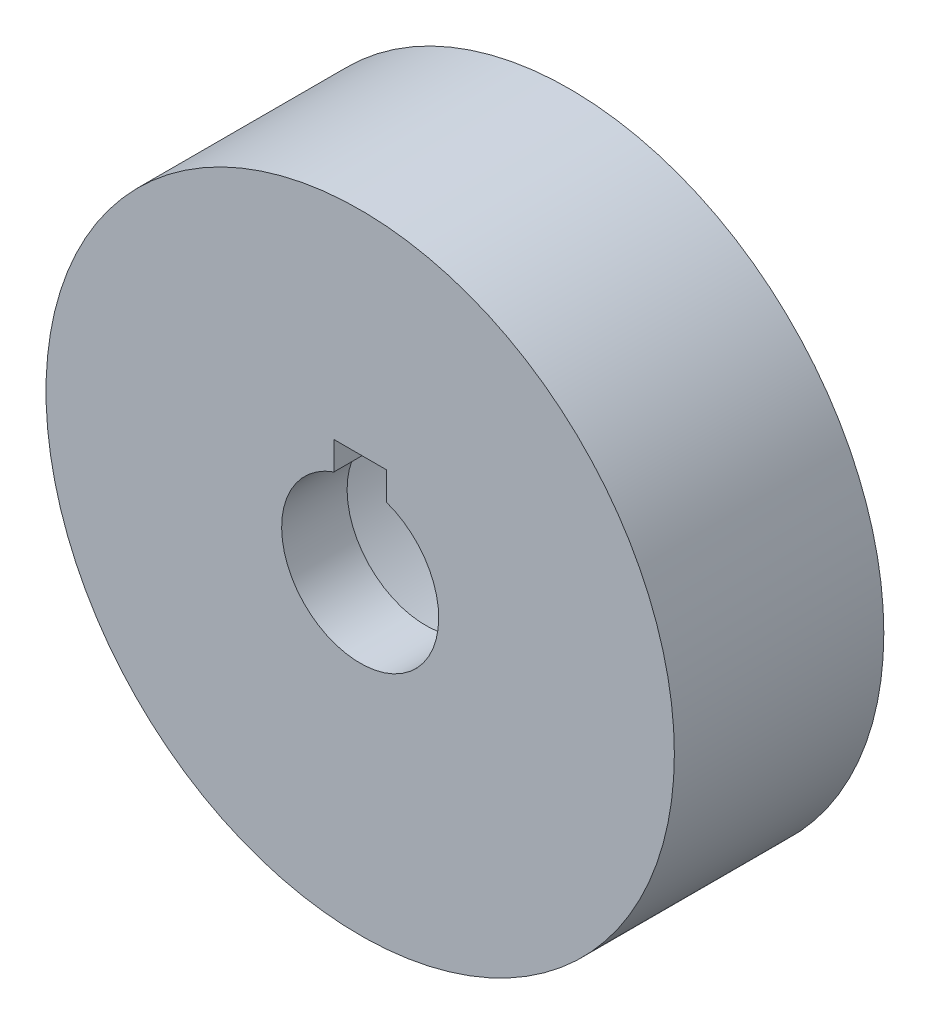
ISO-10303-21;
HEADER;
FILE_DESCRIPTION(('STEP AP214'),'2;1');
FILE_NAME('part.step','',(''),(''),'','','');
FILE_SCHEMA(('AUTOMOTIVE_DESIGN { 1 0 10303 214 1 1 1 1 }'));
ENDSEC;
DATA;
#1=APPLICATION_CONTEXT('core data for automotive mechanical design processes');
#2=APPLICATION_PROTOCOL_DEFINITION('international standard','automotive_design',2000,#1);
#3=PRODUCT_CONTEXT('',#1,'mechanical');
#4=PRODUCT('Part','Part','',(#3));
#5=PRODUCT_RELATED_PRODUCT_CATEGORY('part','',(#4));
#6=PRODUCT_DEFINITION_FORMATION('','',#4);
#7=PRODUCT_DEFINITION_CONTEXT('part definition',#1,'design');
#8=PRODUCT_DEFINITION('design','',#6,#7);
#9=PRODUCT_DEFINITION_SHAPE('','',#8);
#10=(LENGTH_UNIT() NAMED_UNIT(*) SI_UNIT(.MILLI.,.METRE.));
#11=(NAMED_UNIT(*) PLANE_ANGLE_UNIT() SI_UNIT($,.RADIAN.));
#12=(NAMED_UNIT(*) SI_UNIT($,.STERADIAN.) SOLID_ANGLE_UNIT());
#13=UNCERTAINTY_MEASURE_WITH_UNIT(LENGTH_MEASURE(1.E-05),#10,'distance_accuracy_value','');
#14=(GEOMETRIC_REPRESENTATION_CONTEXT(3) GLOBAL_UNCERTAINTY_ASSIGNED_CONTEXT((#13)) GLOBAL_UNIT_ASSIGNED_CONTEXT((#10,
#11,#12)) REPRESENTATION_CONTEXT('',''));
#15=CARTESIAN_POINT('',(0.,0.,0.));
#16=DIRECTION('',(0.,0.,1.));
#17=DIRECTION('',(1.,0.,0.));
#18=AXIS2_PLACEMENT_3D('',#15,#16,#17);
#19=CARTESIAN_POINT('',(0.,0.,0.));
#20=DIRECTION('',(0.,0.,1.));
#21=DIRECTION('',(1.,0.,0.));
#22=AXIS2_PLACEMENT_3D('',#19,#20,#21);
#23=PLANE('',#22);
#24=CARTESIAN_POINT('',(0.,0.,0.));
#25=DIRECTION('',(0.,0.,1.));
#26=DIRECTION('',(1.,0.,0.));
#27=AXIS2_PLACEMENT_3D('',#24,#25,#26);
#28=CIRCLE('',#27,6.);
#29=CARTESIAN_POINT('',(-2.,5.65685424949238,0.));
#30=VERTEX_POINT('',#29);
#31=CARTESIAN_POINT('',(2.,5.65685424949238,0.));
#32=VERTEX_POINT('',#31);
#33=EDGE_CURVE('E155',#30,#32,#28,.T.);
#34=ORIENTED_EDGE('',*,*,#33,.T.);
#35=DIRECTION('',(0.,-1.,0.));
#36=VECTOR('',#35,1.);
#37=CARTESIAN_POINT('',(2.,0.,0.));
#38=LINE('',#37,#36);
#39=CARTESIAN_POINT('',(2.,7.8,0.));
#40=VERTEX_POINT('',#39);
#41=EDGE_CURVE('E84',#40,#32,#38,.T.);
#42=ORIENTED_EDGE('',*,*,#41,.F.);
#43=DIRECTION('',(1.,0.,0.));
#44=VECTOR('',#43,1.);
#45=CARTESIAN_POINT('',(0.,7.8,0.));
#46=LINE('',#45,#44);
#47=CARTESIAN_POINT('',(-2.,7.8,0.));
#48=VERTEX_POINT('',#47);
#49=EDGE_CURVE('E179',#48,#40,#46,.T.);
#50=ORIENTED_EDGE('',*,*,#49,.F.);
#51=DIRECTION('',(0.,-1.,0.));
#52=VECTOR('',#51,1.);
#53=CARTESIAN_POINT('',(-2.,0.,0.));
#54=LINE('',#53,#52);
#55=EDGE_CURVE('E175',#48,#30,#54,.T.);
#56=ORIENTED_EDGE('',*,*,#55,.T.);
#57=EDGE_LOOP('',(#34,#42,#50,#56));
#58=FACE_BOUND('',#57,.T.);
#59=CARTESIAN_POINT('',(0.,0.,0.));
#60=DIRECTION('',(0.,0.,1.));
#61=DIRECTION('',(1.,0.,0.));
#62=AXIS2_PLACEMENT_3D('',#59,#60,#61);
#63=CIRCLE('',#62,15.5);
#64=CARTESIAN_POINT('',(15.5,0.,0.));
#65=VERTEX_POINT('',#64);
#66=EDGE_CURVE('E11',#65,#65,#63,.T.);
#67=ORIENTED_EDGE('',*,*,#66,.F.);
#68=EDGE_LOOP('',(#67));
#69=FACE_BOUND('',#68,.T.);
#70=ADVANCED_FACE('F47',(#58,#69),#23,.F.);
#71=CARTESIAN_POINT('',(0.,0.,5.));
#72=DIRECTION('',(0.,0.,-1.));
#73=DIRECTION('',(-1.,0.,0.));
#74=AXIS2_PLACEMENT_3D('',#71,#72,#73);
#75=CYLINDRICAL_SURFACE('',#74,6.);
#76=ORIENTED_EDGE('',*,*,#33,.F.);
#77=DIRECTION('',(0.,0.,-1.));
#78=VECTOR('',#77,1.);
#79=CARTESIAN_POINT('',(-2.,5.65685424949238,5.));
#80=LINE('',#79,#78);
#81=CARTESIAN_POINT('',(-2.,5.65685424949238,5.));
#82=VERTEX_POINT('',#81);
#83=EDGE_CURVE('E51',#82,#30,#80,.T.);
#84=ORIENTED_EDGE('',*,*,#83,.F.);
#85=CARTESIAN_POINT('',(0.,0.,5.));
#86=DIRECTION('',(0.,0.,1.));
#87=DIRECTION('',(1.,0.,0.));
#88=AXIS2_PLACEMENT_3D('',#85,#86,#87);
#89=CIRCLE('',#88,6.);
#90=CARTESIAN_POINT('',(2.,5.65685424949238,5.));
#91=VERTEX_POINT('',#90);
#92=EDGE_CURVE('E161',#82,#91,#89,.T.);
#93=ORIENTED_EDGE('',*,*,#92,.T.);
#94=DIRECTION('',(0.,0.,-1.));
#95=VECTOR('',#94,1.);
#96=CARTESIAN_POINT('',(2.,5.65685424949238,5.));
#97=LINE('',#96,#95);
#98=EDGE_CURVE('E91',#91,#32,#97,.T.);
#99=ORIENTED_EDGE('',*,*,#98,.T.);
#100=EDGE_LOOP('',(#76,#84,#93,#99));
#101=FACE_BOUND('',#100,.T.);
#102=ADVANCED_FACE('F198',(#101),#75,.F.);
#103=CARTESIAN_POINT('',(-2.,0.,5.));
#104=DIRECTION('',(1.,0.,0.));
#105=DIRECTION('',(0.,0.,-1.));
#106=AXIS2_PLACEMENT_3D('',#103,#104,#105);
#107=PLANE('',#106);
#108=ORIENTED_EDGE('',*,*,#55,.F.);
#109=DIRECTION('',(0.,0.,-1.));
#110=VECTOR('',#109,1.);
#111=CARTESIAN_POINT('',(-2.,7.8,5.));
#112=LINE('',#111,#110);
#113=CARTESIAN_POINT('',(-2.,7.8,5.));
#114=VERTEX_POINT('',#113);
#115=EDGE_CURVE('E189',#114,#48,#112,.T.);
#116=ORIENTED_EDGE('',*,*,#115,.F.);
#117=DIRECTION('',(0.,-1.,0.));
#118=VECTOR('',#117,1.);
#119=CARTESIAN_POINT('',(-2.,0.,5.));
#120=LINE('',#119,#118);
#121=EDGE_CURVE('E164',#114,#82,#120,.T.);
#122=ORIENTED_EDGE('',*,*,#121,.T.);
#123=ORIENTED_EDGE('',*,*,#83,.T.);
#124=EDGE_LOOP('',(#108,#116,#122,#123));
#125=FACE_BOUND('',#124,.T.);
#126=ADVANCED_FACE('F196',(#125),#107,.T.);
#127=CARTESIAN_POINT('',(0.,7.8,5.));
#128=DIRECTION('',(0.,1.,0.));
#129=DIRECTION('',(0.,0.,1.));
#130=AXIS2_PLACEMENT_3D('',#127,#128,#129);
#131=PLANE('',#130);
#132=ORIENTED_EDGE('',*,*,#49,.T.);
#133=DIRECTION('',(0.,0.,-1.));
#134=VECTOR('',#133,1.);
#135=CARTESIAN_POINT('',(2.,7.8,5.));
#136=LINE('',#135,#134);
#137=CARTESIAN_POINT('',(2.,7.8,5.));
#138=VERTEX_POINT('',#137);
#139=EDGE_CURVE('E187',#138,#40,#136,.T.);
#140=ORIENTED_EDGE('',*,*,#139,.F.);
#141=DIRECTION('',(1.,0.,0.));
#142=VECTOR('',#141,1.);
#143=CARTESIAN_POINT('',(0.,7.8,5.));
#144=LINE('',#143,#142);
#145=EDGE_CURVE('E168',#114,#138,#144,.T.);
#146=ORIENTED_EDGE('',*,*,#145,.F.);
#147=ORIENTED_EDGE('',*,*,#115,.T.);
#148=EDGE_LOOP('',(#132,#140,#146,#147));
#149=FACE_BOUND('',#148,.T.);
#150=ADVANCED_FACE('F201',(#149),#131,.F.);
#151=CARTESIAN_POINT('',(0.,0.,5.));
#152=DIRECTION('',(0.,0.,-1.));
#153=DIRECTION('',(-1.,0.,0.));
#154=AXIS2_PLACEMENT_3D('',#151,#152,#153);
#155=CYLINDRICAL_SURFACE('',#154,24.);
#156=CARTESIAN_POINT('',(0.,0.,5.));
#157=DIRECTION('',(0.,0.,1.));
#158=DIRECTION('',(1.,0.,0.));
#159=AXIS2_PLACEMENT_3D('',#156,#157,#158);
#160=CIRCLE('',#159,24.);
#161=CARTESIAN_POINT('',(24.,0.,5.));
#162=VERTEX_POINT('',#161);
#163=EDGE_CURVE('E157',#162,#162,#160,.T.);
#164=ORIENTED_EDGE('',*,*,#163,.F.);
#165=EDGE_LOOP('',(#164));
#166=FACE_BOUND('',#165,.T.);
#167=CARTESIAN_POINT('',(0.,0.,-11.));
#168=DIRECTION('',(0.,0.,1.));
#169=DIRECTION('',(1.,0.,0.));
#170=AXIS2_PLACEMENT_3D('',#167,#168,#169);
#171=CIRCLE('',#170,24.);
#172=CARTESIAN_POINT('',(24.,0.,-11.));
#173=VERTEX_POINT('',#172);
#174=EDGE_CURVE('E152',#173,#173,#171,.T.);
#175=ORIENTED_EDGE('',*,*,#174,.T.);
#176=EDGE_LOOP('',(#175));
#177=FACE_BOUND('',#176,.T.);
#178=ADVANCED_FACE('F49',(#166,#177),#155,.T.);
#179=CARTESIAN_POINT('',(2.,0.,5.));
#180=DIRECTION('',(1.,0.,0.));
#181=DIRECTION('',(0.,0.,-1.));
#182=AXIS2_PLACEMENT_3D('',#179,#180,#181);
#183=PLANE('',#182);
#184=ORIENTED_EDGE('',*,*,#41,.T.);
#185=ORIENTED_EDGE('',*,*,#98,.F.);
#186=DIRECTION('',(0.,-1.,0.));
#187=VECTOR('',#186,1.);
#188=CARTESIAN_POINT('',(2.,0.,5.));
#189=LINE('',#188,#187);
#190=EDGE_CURVE('E66',#138,#91,#189,.T.);
#191=ORIENTED_EDGE('',*,*,#190,.F.);
#192=ORIENTED_EDGE('',*,*,#139,.T.);
#193=EDGE_LOOP('',(#184,#185,#191,#192));
#194=FACE_BOUND('',#193,.T.);
#195=ADVANCED_FACE('F203',(#194),#183,.F.);
#196=CARTESIAN_POINT('',(0.,0.,5.));
#197=DIRECTION('',(0.,0.,1.));
#198=DIRECTION('',(1.,0.,0.));
#199=AXIS2_PLACEMENT_3D('',#196,#197,#198);
#200=PLANE('',#199);
#201=ORIENTED_EDGE('',*,*,#163,.T.);
#202=EDGE_LOOP('',(#201));
#203=FACE_BOUND('',#202,.T.);
#204=ORIENTED_EDGE('',*,*,#92,.F.);
#205=ORIENTED_EDGE('',*,*,#121,.F.);
#206=ORIENTED_EDGE('',*,*,#145,.T.);
#207=ORIENTED_EDGE('',*,*,#190,.T.);
#208=EDGE_LOOP('',(#204,#205,#206,#207));
#209=FACE_BOUND('',#208,.T.);
#210=ADVANCED_FACE('F204',(#203,#209),#200,.T.);
#211=CARTESIAN_POINT('',(0.,0.,-11.));
#212=DIRECTION('',(0.,0.,1.));
#213=DIRECTION('',(1.,0.,0.));
#214=AXIS2_PLACEMENT_3D('',#211,#212,#213);
#215=CYLINDRICAL_SURFACE('',#214,15.5);
#216=CARTESIAN_POINT('',(0.,0.,-11.));
#217=DIRECTION('',(0.,0.,1.));
#218=DIRECTION('',(1.,0.,0.));
#219=AXIS2_PLACEMENT_3D('',#216,#217,#218);
#220=CIRCLE('',#219,15.5);
#221=CARTESIAN_POINT('',(15.5,0.,-11.));
#222=VERTEX_POINT('',#221);
#223=EDGE_CURVE('E148',#222,#222,#220,.T.);
#224=ORIENTED_EDGE('',*,*,#223,.F.);
#225=EDGE_LOOP('',(#224));
#226=FACE_BOUND('',#225,.T.);
#227=ORIENTED_EDGE('',*,*,#66,.T.);
#228=EDGE_LOOP('',(#227));
#229=FACE_BOUND('',#228,.T.);
#230=ADVANCED_FACE('F206',(#226,#229),#215,.F.);
#231=CARTESIAN_POINT('',(0.,0.,-11.));
#232=DIRECTION('',(0.,0.,1.));
#233=DIRECTION('',(1.,0.,0.));
#234=AXIS2_PLACEMENT_3D('',#231,#232,#233);
#235=PLANE('',#234);
#236=CARTESIAN_POINT('',(0.,-19.75,-11.));
#237=DIRECTION('',(0.,0.,-1.));
#238=DIRECTION('',(-1.,0.,0.));
#239=AXIS2_PLACEMENT_3D('',#236,#237,#238);
#240=CIRCLE('',#239,2.1);
#241=CARTESIAN_POINT('',(-2.1,-19.75,-11.));
#242=VERTEX_POINT('',#241);
#243=EDGE_CURVE('E119',#242,#242,#240,.T.);
#244=ORIENTED_EDGE('',*,*,#243,.F.);
#245=EDGE_LOOP('',(#244));
#246=FACE_BOUND('',#245,.T.);
#247=CARTESIAN_POINT('',(-19.75,0.,-11.));
#248=DIRECTION('',(0.,0.,-1.));
#249=DIRECTION('',(-1.,0.,0.));
#250=AXIS2_PLACEMENT_3D('',#247,#248,#249);
#251=CIRCLE('',#250,2.1);
#252=CARTESIAN_POINT('',(-21.85,0.,-11.));
#253=VERTEX_POINT('',#252);
#254=EDGE_CURVE('E118',#253,#253,#251,.T.);
#255=ORIENTED_EDGE('',*,*,#254,.F.);
#256=EDGE_LOOP('',(#255));
#257=FACE_BOUND('',#256,.T.);
#258=CARTESIAN_POINT('',(0.,19.75,-11.));
#259=DIRECTION('',(0.,0.,-1.));
#260=DIRECTION('',(-1.,0.,0.));
#261=AXIS2_PLACEMENT_3D('',#258,#259,#260);
#262=CIRCLE('',#261,2.1);
#263=CARTESIAN_POINT('',(-2.1,19.75,-11.));
#264=VERTEX_POINT('',#263);
#265=EDGE_CURVE('E132',#264,#264,#262,.T.);
#266=ORIENTED_EDGE('',*,*,#265,.F.);
#267=EDGE_LOOP('',(#266));
#268=FACE_BOUND('',#267,.T.);
#269=CARTESIAN_POINT('',(19.75,0.,-11.));
#270=DIRECTION('',(0.,0.,-1.));
#271=DIRECTION('',(-1.,0.,0.));
#272=AXIS2_PLACEMENT_3D('',#269,#270,#271);
#273=CIRCLE('',#272,2.1);
#274=CARTESIAN_POINT('',(17.65,0.,-11.));
#275=VERTEX_POINT('',#274);
#276=EDGE_CURVE('E140',#275,#275,#273,.T.);
#277=ORIENTED_EDGE('',*,*,#276,.F.);
#278=EDGE_LOOP('',(#277));
#279=FACE_BOUND('',#278,.T.);
#280=ORIENTED_EDGE('',*,*,#223,.T.);
#281=EDGE_LOOP('',(#280));
#282=FACE_BOUND('',#281,.T.);
#283=ORIENTED_EDGE('',*,*,#174,.F.);
#284=EDGE_LOOP('',(#283));
#285=FACE_BOUND('',#284,.T.);
#286=ADVANCED_FACE('F214',(#246,#257,#268,#279,#282,#285),#235,.F.);
#287=CARTESIAN_POINT('',(19.75,0.,-0.999999999999999));
#288=DIRECTION('',(0.,0.,-1.));
#289=DIRECTION('',(-1.,0.,0.));
#290=AXIS2_PLACEMENT_3D('',#287,#288,#289);
#291=CONICAL_SURFACE('',#290,2.1,1.02974425867665);
#292=CARTESIAN_POINT('',(19.75,0.,0.261807299957877));
#293=VERTEX_POINT('',#292);
#294=VERTEX_LOOP('',#293);
#295=FACE_BOUND('',#294,.T.);
#296=CARTESIAN_POINT('',(19.75,0.,-0.999999999999999));
#297=DIRECTION('',(0.,0.,-1.));
#298=DIRECTION('',(-1.,0.,0.));
#299=AXIS2_PLACEMENT_3D('',#296,#297,#298);
#300=CIRCLE('',#299,2.1);
#301=CARTESIAN_POINT('',(17.65,0.,-0.999999999999999));
#302=VERTEX_POINT('',#301);
#303=EDGE_CURVE('E144',#302,#302,#300,.T.);
#304=ORIENTED_EDGE('',*,*,#303,.T.);
#305=EDGE_LOOP('',(#304));
#306=FACE_BOUND('',#305,.T.);
#307=ADVANCED_FACE('F280',(#295,#306),#291,.F.);
#308=CARTESIAN_POINT('',(19.75,0.,-11.));
#309=DIRECTION('',(0.,0.,-1.));
#310=DIRECTION('',(-1.,0.,0.));
#311=AXIS2_PLACEMENT_3D('',#308,#309,#310);
#312=CYLINDRICAL_SURFACE('',#311,2.1);
#313=ORIENTED_EDGE('',*,*,#303,.F.);
#314=EDGE_LOOP('',(#313));
#315=FACE_BOUND('',#314,.T.);
#316=ORIENTED_EDGE('',*,*,#276,.T.);
#317=EDGE_LOOP('',(#316));
#318=FACE_BOUND('',#317,.T.);
#319=ADVANCED_FACE('F290',(#315,#318),#312,.F.);
#320=CARTESIAN_POINT('',(0.,19.75,-0.999999999999999));
#321=DIRECTION('',(0.,0.,-1.));
#322=DIRECTION('',(-1.,0.,0.));
#323=AXIS2_PLACEMENT_3D('',#320,#321,#322);
#324=CONICAL_SURFACE('',#323,2.1,1.02974425867665);
#325=CARTESIAN_POINT('',(0.,19.75,0.261807299957877));
#326=VERTEX_POINT('',#325);
#327=VERTEX_LOOP('',#326);
#328=FACE_BOUND('',#327,.T.);
#329=CARTESIAN_POINT('',(0.,19.75,-0.999999999999999));
#330=DIRECTION('',(0.,0.,-1.));
#331=DIRECTION('',(-1.,0.,0.));
#332=AXIS2_PLACEMENT_3D('',#329,#330,#331);
#333=CIRCLE('',#332,2.1);
#334=CARTESIAN_POINT('',(-2.1,19.75,-0.999999999999999));
#335=VERTEX_POINT('',#334);
#336=EDGE_CURVE('E136',#335,#335,#333,.T.);
#337=ORIENTED_EDGE('',*,*,#336,.T.);
#338=EDGE_LOOP('',(#337));
#339=FACE_BOUND('',#338,.T.);
#340=ADVANCED_FACE('F300',(#328,#339),#324,.F.);
#341=CARTESIAN_POINT('',(0.,19.75,-11.));
#342=DIRECTION('',(0.,0.,-1.));
#343=DIRECTION('',(-1.,0.,0.));
#344=AXIS2_PLACEMENT_3D('',#341,#342,#343);
#345=CYLINDRICAL_SURFACE('',#344,2.1);
#346=ORIENTED_EDGE('',*,*,#336,.F.);
#347=EDGE_LOOP('',(#346));
#348=FACE_BOUND('',#347,.T.);
#349=ORIENTED_EDGE('',*,*,#265,.T.);
#350=EDGE_LOOP('',(#349));
#351=FACE_BOUND('',#350,.T.);
#352=ADVANCED_FACE('F310',(#348,#351),#345,.F.);
#353=CARTESIAN_POINT('',(-19.75,0.,-0.999999999999999));
#354=DIRECTION('',(0.,0.,-1.));
#355=DIRECTION('',(-1.,0.,0.));
#356=AXIS2_PLACEMENT_3D('',#353,#354,#355);
#357=CONICAL_SURFACE('',#356,2.1,1.02974425867665);
#358=CARTESIAN_POINT('',(-19.75,0.,0.261807299957877));
#359=VERTEX_POINT('',#358);
#360=VERTEX_LOOP('',#359);
#361=FACE_BOUND('',#360,.T.);
#362=CARTESIAN_POINT('',(-19.75,0.,-0.999999999999999));
#363=DIRECTION('',(0.,0.,-1.));
#364=DIRECTION('',(-1.,0.,0.));
#365=AXIS2_PLACEMENT_3D('',#362,#363,#364);
#366=CIRCLE('',#365,2.1);
#367=CARTESIAN_POINT('',(-21.85,0.,-0.999999999999999));
#368=VERTEX_POINT('',#367);
#369=EDGE_CURVE('E124',#368,#368,#366,.T.);
#370=ORIENTED_EDGE('',*,*,#369,.T.);
#371=EDGE_LOOP('',(#370));
#372=FACE_BOUND('',#371,.T.);
#373=ADVANCED_FACE('F320',(#361,#372),#357,.F.);
#374=CARTESIAN_POINT('',(-19.75,0.,-11.));
#375=DIRECTION('',(0.,0.,-1.));
#376=DIRECTION('',(-1.,0.,0.));
#377=AXIS2_PLACEMENT_3D('',#374,#375,#376);
#378=CYLINDRICAL_SURFACE('',#377,2.1);
#379=ORIENTED_EDGE('',*,*,#369,.F.);
#380=EDGE_LOOP('',(#379));
#381=FACE_BOUND('',#380,.T.);
#382=ORIENTED_EDGE('',*,*,#254,.T.);
#383=EDGE_LOOP('',(#382));
#384=FACE_BOUND('',#383,.T.);
#385=ADVANCED_FACE('F111',(#381,#384),#378,.F.);
#386=CARTESIAN_POINT('',(0.,-19.75,-0.999999999999999));
#387=DIRECTION('',(0.,0.,-1.));
#388=DIRECTION('',(-1.,0.,0.));
#389=AXIS2_PLACEMENT_3D('',#386,#387,#388);
#390=CONICAL_SURFACE('',#389,2.1,1.02974425867665);
#391=CARTESIAN_POINT('',(0.,-19.75,0.261807299957877));
#392=VERTEX_POINT('',#391);
#393=VERTEX_LOOP('',#392);
#394=FACE_BOUND('',#393,.T.);
#395=CARTESIAN_POINT('',(0.,-19.75,-0.999999999999999));
#396=DIRECTION('',(0.,0.,-1.));
#397=DIRECTION('',(-1.,0.,0.));
#398=AXIS2_PLACEMENT_3D('',#395,#396,#397);
#399=CIRCLE('',#398,2.1);
#400=CARTESIAN_POINT('',(-2.1,-19.75,-0.999999999999999));
#401=VERTEX_POINT('',#400);
#402=EDGE_CURVE('E115',#401,#401,#399,.T.);
#403=ORIENTED_EDGE('',*,*,#402,.T.);
#404=EDGE_LOOP('',(#403));
#405=FACE_BOUND('',#404,.T.);
#406=ADVANCED_FACE('F107',(#394,#405),#390,.F.);
#407=CARTESIAN_POINT('',(0.,-19.75,-11.));
#408=DIRECTION('',(0.,0.,-1.));
#409=DIRECTION('',(-1.,0.,0.));
#410=AXIS2_PLACEMENT_3D('',#407,#408,#409);
#411=CYLINDRICAL_SURFACE('',#410,2.1);
#412=ORIENTED_EDGE('',*,*,#402,.F.);
#413=EDGE_LOOP('',(#412));
#414=FACE_BOUND('',#413,.T.);
#415=ORIENTED_EDGE('',*,*,#243,.T.);
#416=EDGE_LOOP('',(#415));
#417=FACE_BOUND('',#416,.T.);
#418=ADVANCED_FACE('F110',(#414,#417),#411,.F.);
#419=CLOSED_SHELL('',(#70,#102,#126,#150,#178,#195,#210,#230,#286,#307,#319,#340,#352,#373,#385,
#406,#418));
#420=MANIFOLD_SOLID_BREP('B2',#419);
#421=ADVANCED_BREP_SHAPE_REPRESENTATION('',(#18,#420),#14);
#422=SHAPE_DEFINITION_REPRESENTATION(#9,#421);
ENDSEC;
END-ISO-10303-21;
